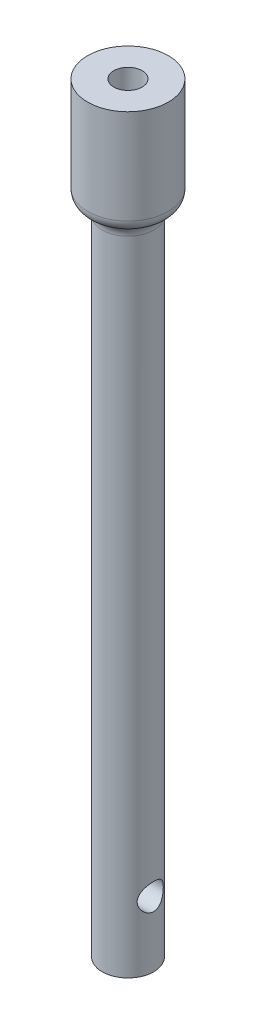
ISO-10303-21;
HEADER;
FILE_DESCRIPTION(('STEP AP214'),'2;1');
FILE_NAME('part.step','',(''),(''),'','','');
FILE_SCHEMA(('AUTOMOTIVE_DESIGN { 1 0 10303 214 1 1 1 1 }'));
ENDSEC;
DATA;
#1=APPLICATION_CONTEXT('core data for automotive mechanical design processes');
#2=APPLICATION_PROTOCOL_DEFINITION('international standard','automotive_design',2000,#1);
#3=PRODUCT_CONTEXT('',#1,'mechanical');
#4=PRODUCT('Part','Part','',(#3));
#5=PRODUCT_RELATED_PRODUCT_CATEGORY('part','',(#4));
#6=PRODUCT_DEFINITION_FORMATION('','',#4);
#7=PRODUCT_DEFINITION_CONTEXT('part definition',#1,'design');
#8=PRODUCT_DEFINITION('design','',#6,#7);
#9=PRODUCT_DEFINITION_SHAPE('','',#8);
#10=(LENGTH_UNIT() NAMED_UNIT(*) SI_UNIT(.MILLI.,.METRE.));
#11=(NAMED_UNIT(*) PLANE_ANGLE_UNIT() SI_UNIT($,.RADIAN.));
#12=(NAMED_UNIT(*) SI_UNIT($,.STERADIAN.) SOLID_ANGLE_UNIT());
#13=UNCERTAINTY_MEASURE_WITH_UNIT(LENGTH_MEASURE(1.E-05),#10,'distance_accuracy_value','');
#14=(GEOMETRIC_REPRESENTATION_CONTEXT(3) GLOBAL_UNCERTAINTY_ASSIGNED_CONTEXT((#13)) GLOBAL_UNIT_ASSIGNED_CONTEXT((#10,
#11,#12)) REPRESENTATION_CONTEXT('',''));
#15=CARTESIAN_POINT('',(0.,0.,0.));
#16=DIRECTION('',(0.,0.,1.));
#17=DIRECTION('',(1.,0.,0.));
#18=AXIS2_PLACEMENT_3D('',#15,#16,#17);
#19=CARTESIAN_POINT('',(0.,220.,0.));
#20=DIRECTION('',(0.,1.,0.));
#21=DIRECTION('',(-1.,0.,0.));
#22=AXIS2_PLACEMENT_3D('',#19,#20,#21);
#23=CYLINDRICAL_SURFACE('',#22,4.35);
#24=CARTESIAN_POINT('',(0.,233.,0.));
#25=DIRECTION('',(0.,1.,0.));
#26=DIRECTION('',(-1.,0.,0.));
#27=AXIS2_PLACEMENT_3D('',#24,#25,#26);
#28=CIRCLE('',#27,4.35);
#29=CARTESIAN_POINT('',(-4.35,233.,0.));
#30=VERTEX_POINT('',#29);
#31=EDGE_CURVE('E76',#30,#30,#28,.T.);
#32=ORIENTED_EDGE('',*,*,#31,.T.);
#33=EDGE_LOOP('',(#32));
#34=FACE_BOUND('',#33,.T.);
#35=CARTESIAN_POINT('',(0.,220.,0.));
#36=DIRECTION('',(0.,1.,0.));
#37=DIRECTION('',(-1.,0.,0.));
#38=AXIS2_PLACEMENT_3D('',#35,#36,#37);
#39=CIRCLE('',#38,4.35);
#40=CARTESIAN_POINT('',(2.35,220.,-3.66060104354463));
#41=VERTEX_POINT('',#40);
#42=CARTESIAN_POINT('',(2.35,220.,3.66060104354463));
#43=VERTEX_POINT('',#42);
#44=EDGE_CURVE('E73',#41,#43,#39,.T.);
#45=ORIENTED_EDGE('',*,*,#44,.F.);
#46=DIRECTION('',(0.,-1.,0.));
#47=VECTOR('',#46,1.);
#48=CARTESIAN_POINT('',(2.35,230.,-3.66060104354463));
#49=LINE('',#48,#47);
#50=CARTESIAN_POINT('',(2.35,230.,-3.66060104354463));
#51=VERTEX_POINT('',#50);
#52=EDGE_CURVE('E50',#51,#41,#49,.T.);
#53=ORIENTED_EDGE('',*,*,#52,.F.);
#54=CARTESIAN_POINT('',(0.,230.,0.));
#55=DIRECTION('',(0.,1.,0.));
#56=DIRECTION('',(0.,0.,1.));
#57=AXIS2_PLACEMENT_3D('',#54,#55,#56);
#58=CIRCLE('',#57,4.35);
#59=CARTESIAN_POINT('',(2.35,230.,3.66060104354463));
#60=VERTEX_POINT('',#59);
#61=EDGE_CURVE('E69',#60,#51,#58,.T.);
#62=ORIENTED_EDGE('',*,*,#61,.F.);
#63=DIRECTION('',(0.,-1.,0.));
#64=VECTOR('',#63,1.);
#65=CARTESIAN_POINT('',(2.35,230.,3.66060104354463));
#66=LINE('',#65,#64);
#67=EDGE_CURVE('E64',#60,#43,#66,.T.);
#68=ORIENTED_EDGE('',*,*,#67,.T.);
#69=EDGE_LOOP('',(#45,#53,#62,#68));
#70=FACE_BOUND('',#69,.T.);
#71=ADVANCED_FACE('F35',(#34,#70),#23,.F.);
#72=CARTESIAN_POINT('',(-4.35,220.,0.));
#73=DIRECTION('',(0.,1.,0.));
#74=DIRECTION('',(-1.,0.,0.));
#75=AXIS2_PLACEMENT_3D('',#72,#73,#74);
#76=PLANE('',#75);
#77=ORIENTED_EDGE('',*,*,#44,.T.);
#78=DIRECTION('',(0.,0.,1.));
#79=VECTOR('',#78,1.);
#80=CARTESIAN_POINT('',(2.35,220.,0.));
#81=LINE('',#80,#79);
#82=EDGE_CURVE('E61',#41,#43,#81,.T.);
#83=ORIENTED_EDGE('',*,*,#82,.F.);
#84=EDGE_LOOP('',(#77,#83));
#85=FACE_BOUND('',#84,.T.);
#86=ADVANCED_FACE('F75',(#85),#76,.T.);
#87=CARTESIAN_POINT('',(0.,0.,0.));
#88=DIRECTION('',(0.,-1.,0.));
#89=DIRECTION('',(1.,0.,0.));
#90=AXIS2_PLACEMENT_3D('',#87,#88,#89);
#91=PLANE('',#90);
#92=CARTESIAN_POINT('',(0.,0.,0.));
#93=DIRECTION('',(0.,1.,0.));
#94=DIRECTION('',(-1.,0.,0.));
#95=AXIS2_PLACEMENT_3D('',#92,#93,#94);
#96=CIRCLE('',#95,7.9);
#97=CARTESIAN_POINT('',(-7.9,0.,0.));
#98=VERTEX_POINT('',#97);
#99=EDGE_CURVE('E85',#98,#98,#96,.T.);
#100=ORIENTED_EDGE('',*,*,#99,.F.);
#101=EDGE_LOOP('',(#100));
#102=FACE_BOUND('',#101,.T.);
#103=ADVANCED_FACE('F120',(#102),#91,.T.);
#104=CARTESIAN_POINT('',(0.,220.,0.));
#105=DIRECTION('',(0.,1.,0.));
#106=DIRECTION('',(-1.,0.,0.));
#107=AXIS2_PLACEMENT_3D('',#104,#105,#106);
#108=CYLINDRICAL_SURFACE('',#107,7.9);
#109=CARTESIAN_POINT('',(0.,196.830795023156,0.));
#110=DIRECTION('',(0.,1.,0.));
#111=DIRECTION('',(-1.,0.,0.));
#112=AXIS2_PLACEMENT_3D('',#109,#110,#111);
#113=CIRCLE('',#112,7.9);
#114=CARTESIAN_POINT('',(-7.9,196.830795023156,0.));
#115=VERTEX_POINT('',#114);
#116=EDGE_CURVE('E11',#115,#115,#113,.F.);
#117=ORIENTED_EDGE('',*,*,#116,.T.);
#118=EDGE_LOOP('',(#117));
#119=FACE_BOUND('',#118,.T.);
#120=CARTESIAN_POINT('',(-7.9,16.,0.));
#121=CARTESIAN_POINT('',(-7.89999974326194,16.0000002892942,0.105030355423712));
#122=CARTESIAN_POINT('',(-7.89790047747461,16.0041416620161,0.210065854151533));
#123=CARTESIAN_POINT('',(-7.88955731330269,16.0206578079268,0.419359685412036));
#124=CARTESIAN_POINT('',(-7.88331168129006,16.0330360250093,0.52361767441581));
#125=CARTESIAN_POINT('',(-7.86682303781086,16.0659043212627,0.730677490115829));
#126=CARTESIAN_POINT('',(-7.85657455298263,16.0864055080562,0.833477122391393));
#127=CARTESIAN_POINT('',(-7.83234629696176,16.1352760728215,1.03675350148522));
#128=CARTESIAN_POINT('',(-7.81836500057555,16.1636486671662,1.13722928052203));
#129=CARTESIAN_POINT('',(-7.7714459431176,16.2598721560975,1.43327688410579));
#130=CARTESIAN_POINT('',(-7.73344417287942,16.3389989282909,1.62451959753274));
#131=CARTESIAN_POINT('',(-7.64741391394349,16.5244195730602,1.99061587701824));
#132=CARTESIAN_POINT('',(-7.59938605156838,16.6307117487264,2.16547046584277));
#133=CARTESIAN_POINT('',(-7.49421305018786,16.8749232668228,2.50607913541061));
#134=CARTESIAN_POINT('',(-7.43668860357155,17.0143870936976,2.6706098179426));
#135=CARTESIAN_POINT('',(-7.32022262086627,17.3175948281385,2.97505854091777));
#136=CARTESIAN_POINT('',(-7.26128001591896,17.4813575626054,3.11495731100717));
#137=CARTESIAN_POINT('',(-7.14317193551608,17.8444163400706,3.37749122414735));
#138=CARTESIAN_POINT('',(-7.08436624958561,18.0455073575278,3.49784826094683));
#139=CARTESIAN_POINT('',(-7.00580901734669,18.3623585147373,3.65129455073703));
#140=CARTESIAN_POINT('',(-6.98122520578246,18.4705501357025,3.69793951914284));
#141=CARTESIAN_POINT('',(-6.93620031234022,18.6913636996881,3.78171735483549));
#142=CARTESIAN_POINT('',(-6.91575675143148,18.8039829430795,3.81885591774758));
#143=CARTESIAN_POINT('',(-6.88095029874377,19.0259546427392,3.88120116806592));
#144=CARTESIAN_POINT('',(-6.86629640794754,19.1350983663657,3.90698956573442));
#145=CARTESIAN_POINT('',(-6.8420152512109,19.3556605838196,3.94935764289151));
#146=CARTESIAN_POINT('',(-6.83238528539859,19.4670778223303,3.96594226881995));
#147=CARTESIAN_POINT('',(-6.81856813282619,19.691180392024,3.98965140930813));
#148=CARTESIAN_POINT('',(-6.81437746738349,19.8038648661866,3.99678197023975));
#149=CARTESIAN_POINT('',(-6.81161860089242,20.0294952726462,4.00148228877337));
#150=CARTESIAN_POINT('',(-6.81304983862458,20.1424411777203,3.99905300070932));
#151=CARTESIAN_POINT('',(-6.82094579868876,20.3535727352705,3.98556752403533));
#152=CARTESIAN_POINT('',(-6.82676556441021,20.4518549536128,3.97561636469917));
#153=CARTESIAN_POINT('',(-6.84245971450048,20.6471080740119,3.94854165195411));
#154=CARTESIAN_POINT('',(-6.85233536767017,20.7440785559047,3.93141585407363));
#155=CARTESIAN_POINT('',(-6.88759171848113,21.0320161533534,3.86954771341741));
#156=CARTESIAN_POINT('',(-6.91860783899296,21.2201516609621,3.81430520236363));
#157=CARTESIAN_POINT('',(-6.99284416527983,21.5884995507509,3.67645598092139));
#158=CARTESIAN_POINT('',(-7.03633109292407,21.7684264191954,3.59324350696203));
#159=CARTESIAN_POINT('',(-7.13063376216339,22.1126679136086,3.40226267800552));
#160=CARTESIAN_POINT('',(-7.18145279487094,22.2769754734083,3.29448328315597));
#161=CARTESIAN_POINT('',(-7.29269429420413,22.6078282907292,3.04107908445073));
#162=CARTESIAN_POINT('',(-7.3535046648423,22.7718686654976,2.89235127479011));
#163=CARTESIAN_POINT('',(-7.47254836479071,23.073800536734,2.56916422163046));
#164=CARTESIAN_POINT('',(-7.53078039067481,23.2116789207165,2.39469215247803));
#165=CARTESIAN_POINT('',(-7.6131586058754,23.399046005838,2.1119067443416));
#166=CARTESIAN_POINT('',(-7.64035721928503,23.4594115025598,2.0115320845985));
#167=CARTESIAN_POINT('',(-7.69169937773719,23.5713750458255,1.8052781707983));
#168=CARTESIAN_POINT('',(-7.71584421237342,23.6229767964276,1.69940126713828));
#169=CARTESIAN_POINT('',(-7.76036591092704,23.7168515235388,1.48288097038576));
#170=CARTESIAN_POINT('',(-7.78074434066851,23.7591283781482,1.37223958174828));
#171=CARTESIAN_POINT('',(-7.8171236462859,23.8338608710172,1.14698932082252));
#172=CARTESIAN_POINT('',(-7.83312504023045,23.8663176716328,1.03238091988277));
#173=CARTESIAN_POINT('',(-7.85909847239651,23.9186603667973,0.809959262578977));
#174=CARTESIAN_POINT('',(-7.86946476008195,23.9393746711275,0.7023864692307));
#175=CARTESIAN_POINT('',(-7.88581165461011,23.9719295767871,0.485580322168009));
#176=CARTESIAN_POINT('',(-7.89179266253058,23.9837709896335,0.376347121247486));
#177=CARTESIAN_POINT('',(-7.89919730166462,23.9984194395117,0.157165723276311));
#178=CARTESIAN_POINT('',(-7.90062274017059,24.0012300592558,0.0472178271115035));
#179=CARTESIAN_POINT('',(-7.89888059257281,23.9977889781874,-0.172495273618029));
#180=CARTESIAN_POINT('',(-7.89571321999931,23.9915376986832,-0.282260486438589));
#181=CARTESIAN_POINT('',(-7.88531113396588,23.9709198495986,-0.491915004917143));
#182=CARTESIAN_POINT('',(-7.87842317131166,23.9572446882902,-0.591890044204379));
#183=CARTESIAN_POINT('',(-7.86100979646681,23.9224602644512,-0.790227848208988));
#184=CARTESIAN_POINT('',(-7.85048315195254,23.9013484832914,-0.888590054866886));
#185=CARTESIAN_POINT('',(-7.81379211212464,23.8271724739966,-1.18020675248324));
#186=CARTESIAN_POINT('',(-7.7825065741195,23.7632485489558,-1.37018038710244));
#187=CARTESIAN_POINT('',(-7.70801264820104,23.6067031585947,-1.74170773123375));
#188=CARTESIAN_POINT('',(-7.66449468691239,23.5133276328474,-1.92287625345581));
#189=CARTESIAN_POINT('',(-7.56967686499314,23.3013611247766,-2.26759115995563));
#190=CARTESIAN_POINT('',(-7.51837373214007,23.1827595311056,-2.43113008458299));
#191=CARTESIAN_POINT('',(-7.40685344008681,22.9100683806844,-2.75325607693541));
#192=CARTESIAN_POINT('',(-7.34625802207357,22.7536150644413,-2.90970943250473));
#193=CARTESIAN_POINT('',(-7.22666931672465,22.4165117355947,-3.19518932302647));
#194=CARTESIAN_POINT('',(-7.16767723534095,22.2358440845806,-3.32419568587548));
#195=CARTESIAN_POINT('',(-7.08391192667782,21.9444994979911,-3.49751557638399));
#196=CARTESIAN_POINT('',(-7.05616078885691,21.8411813241736,-3.55301013846864));
#197=CARTESIAN_POINT('',(-7.00389124036985,21.6294184907216,-3.65496717427654));
#198=CARTESIAN_POINT('',(-6.97937127148744,21.5209763366349,-3.70143400674679));
#199=CARTESIAN_POINT('',(-6.9345217883005,21.299736355335,-3.7847920060282));
#200=CARTESIAN_POINT('',(-6.91418881945415,21.1869422107752,-3.82169107342396));
#201=CARTESIAN_POINT('',(-6.87855652118034,20.9577778249567,-3.88545988985966));
#202=CARTESIAN_POINT('',(-6.86325638862617,20.8414081575144,-3.91233123918846));
#203=CARTESIAN_POINT('',(-6.83960223930732,20.6175167241593,-3.95352354365859));
#204=CARTESIAN_POINT('',(-6.83071966696499,20.5102273070628,-3.96880673291813));
#205=CARTESIAN_POINT('',(-6.81799965842684,20.2944709027418,-3.99061917549394));
#206=CARTESIAN_POINT('',(-6.81416166405487,20.1860040471387,-3.99714939731652));
#207=CARTESIAN_POINT('',(-6.81169564539614,19.9688746994429,-4.00135124842025));
#208=CARTESIAN_POINT('',(-6.8130656347936,19.8602122977331,-3.99902625506413));
#209=CARTESIAN_POINT('',(-6.8209414363359,19.6436538427938,-3.98557462361757));
#210=CARTESIAN_POINT('',(-6.82744701748266,19.5357577553158,-3.97444838140584));
#211=CARTESIAN_POINT('',(-6.8525146183381,19.2360507486965,-3.93117794537888));
#212=CARTESIAN_POINT('',(-6.87655512752699,19.0459966809426,-3.88934621047486));
#213=CARTESIAN_POINT('',(-6.93754911414543,18.6759611512395,-3.7794557789441));
#214=CARTESIAN_POINT('',(-6.97450683376607,18.4959830209239,-3.71138846543371));
#215=CARTESIAN_POINT('',(-7.06016669913318,18.137685223288,-3.54588185344455));
#216=CARTESIAN_POINT('',(-7.10948969827281,17.9602841396984,-3.44678054377874));
#217=CARTESIAN_POINT('',(-7.21333285722919,17.6234679028573,-3.2238081876595));
#218=CARTESIAN_POINT('',(-7.26785574687759,17.4640622938014,-3.09992409289966));
#219=CARTESIAN_POINT('',(-7.38415278594377,17.14690604811,-2.81268790384531));
#220=CARTESIAN_POINT('',(-7.4459765602823,16.9918845196303,-2.64633163492458));
#221=CARTESIAN_POINT('',(-7.56370384687748,16.7112507084625,-2.28818900499534));
#222=CARTESIAN_POINT('',(-7.6196040574889,16.5856547801295,-2.09638859477865));
#223=CARTESIAN_POINT('',(-7.69478318761917,16.4220065073086,-1.79205596315752));
#224=CARTESIAN_POINT('',(-7.718504407642,16.3713712188137,-1.68721263305615));
#225=CARTESIAN_POINT('',(-7.76225333479594,16.2792165413334,-1.4728727692572));
#226=CARTESIAN_POINT('',(-7.78228285768672,16.2376926689769,-1.3633785558788));
#227=CARTESIAN_POINT('',(-7.81801213665396,16.1643336589293,-1.14077721382273));
#228=CARTESIAN_POINT('',(-7.83372120349474,16.1324776709538,-1.02767844991059));
#229=CARTESIAN_POINT('',(-7.86037273798311,16.0787750202246,-0.798633509505721));
#230=CARTESIAN_POINT('',(-7.87131806827031,16.0569223458382,-0.682689087413789));
#231=CARTESIAN_POINT('',(-7.88642604135818,16.0268595125808,-0.472318675223722));
#232=CARTESIAN_POINT('',(-7.89150659022852,16.0167966253811,-0.378218342982565));
#233=CARTESIAN_POINT('',(-7.89829373120969,16.0033666475549,-0.189413412105658));
#234=CARTESIAN_POINT('',(-7.90000023150786,15.9999997391354,-0.0947087970968657));
#235=CARTESIAN_POINT('',(-7.9,16.,0.));
#236=B_SPLINE_CURVE_WITH_KNOTS('',3,(#120,#121,#122,#123,#124,#125,#126,#127,#128,#129,#130,
#131,#132,#133,#134,#135,#136,#137,#138,#139,#140,#141,#142,#143,#144,#145,#146,#147,#148,#149,
#150,#151,#152,#153,#154,#155,#156,#157,#158,#159,#160,#161,#162,#163,#164,#165,#166,#167,#168,
#169,#170,#171,#172,#173,#174,#175,#176,#177,#178,#179,#180,#181,#182,#183,#184,#185,#186,#187,
#188,#189,#190,#191,#192,#193,#194,#195,#196,#197,#198,#199,#200,#201,#202,#203,#204,#205,#206,
#207,#208,#209,#210,#211,#212,#213,#214,#215,#216,#217,#218,#219,#220,#221,#222,#223,#224,#225,
#226,#227,#228,#229,#230,#231,#232,#233,#234,#235),.UNSPECIFIED.,.T.,.F.,(4,2,2,2,2,2,2,2,2,2,2,
2,2,2,2,2,2,2,2,2,2,2,2,2,2,2,2,2,2,2,2,2,2,2,2,2,2,2,2,2,2,2,2,2,2,2,2,2,2,2,2,2,2,2,2,2,2,4),
(0.,0.314997426512901,0.63012663892187,0.945688265119548,1.261379024834,1.88959720738978,
2.51777615735311,3.18463679773118,3.85201684911854,4.57281530968725,4.93345625460133,
5.29388061827752,5.63270378580962,5.97134468073119,6.30976889234729,6.64815932084365,
6.94466483760132,7.24126318074209,7.83403716521488,8.4405789920717,9.04739392519375,
9.73337884885139,10.4197066877037,10.7800369665323,11.1402145681964,11.5002420931619,
11.8602269865927,12.1898987948637,12.519540447584,12.8490513081237,13.1785468494433,
13.4816040733025,13.7847640352138,14.3905200858336,15.0132528779273,15.6362481425192,
16.3215948131452,17.007443450925,17.3685884075982,17.7295585614174,18.0902296879089,
18.4508432315027,18.7765912302282,19.1023031823159,19.4278909209081,19.7534640154504,
20.3388895206226,20.9245074685875,21.5493514775672,22.1745253411866,22.8783193783996,
23.5825036518905,23.9385580487542,24.2944368503367,24.6495425991363,25.0044346610445,
25.2884688858898,25.5725108396021),.UNSPECIFIED.);
#237=CARTESIAN_POINT('',(-7.9,16.,0.));
#238=VERTEX_POINT('',#237);
#239=EDGE_CURVE('E70',#238,#238,#236,.T.);
#240=ORIENTED_EDGE('',*,*,#239,.F.);
#241=EDGE_LOOP('',(#240));
#242=FACE_BOUND('',#241,.T.);
#243=CARTESIAN_POINT('',(6.81248853210044,20.,-4.));
#244=CARTESIAN_POINT('',(6.81248902646816,20.1040582320195,-3.9999996189172));
#245=CARTESIAN_POINT('',(6.81488096341231,20.2081232486825,-3.9959338997901));
#246=CARTESIAN_POINT('',(6.8243579598398,20.4154458375316,-3.9797266747341));
#247=CARTESIAN_POINT('',(6.8314451281446,20.5187030257938,-3.96758153999728));
#248=CARTESIAN_POINT('',(6.85006189596483,20.7237278425917,-3.93535244365669));
#249=CARTESIAN_POINT('',(6.86159824551742,20.8254929627535,-3.91525641822285));
#250=CARTESIAN_POINT('',(6.88869279080161,21.0266689092288,-3.86738429139156));
#251=CARTESIAN_POINT('',(6.90425273960109,21.126078688668,-3.83960484198546));
#252=CARTESIAN_POINT('',(6.95600228523275,21.4186444941276,-3.74555362754238));
#253=CARTESIAN_POINT('',(6.99739559759641,21.60748891111,-3.66835138352928));
#254=CARTESIAN_POINT('',(7.08926838531521,21.9693955140954,-3.48747825556127));
#255=CARTESIAN_POINT('',(7.13974854817665,22.1424565044389,-3.383805368603));
#256=CARTESIAN_POINT('',(7.24933048299221,22.484180249276,-3.14264236486507));
#257=CARTESIAN_POINT('',(7.30880035601045,22.651228915408,-3.00303168605627));
#258=CARTESIAN_POINT('',(7.42671783069597,22.9608559246805,-2.69824042748942));
#259=CARTESIAN_POINT('',(7.48516489765344,23.1034217926741,-2.53304689310105));
#260=CARTESIAN_POINT('',(7.56976320752312,23.3007811093124,-2.26241165996242));
#261=CARTESIAN_POINT('',(7.59830355793918,23.3655812481772,-2.16486488092228));
#262=CARTESIAN_POINT('',(7.65269976214945,23.4866521296743,-1.96392401518271));
#263=CARTESIAN_POINT('',(7.67855675805761,23.5429265058494,-1.86053244538262));
#264=CARTESIAN_POINT('',(7.72684530591376,23.6463998012438,-1.64853969054746));
#265=CARTESIAN_POINT('',(7.74927694199644,23.693598943379,-1.5399386335555));
#266=CARTESIAN_POINT('',(7.79003365015234,23.7783602158714,-1.31835217262571));
#267=CARTESIAN_POINT('',(7.80836105492395,23.8159278222172,-1.20536930221604));
#268=CARTESIAN_POINT('',(7.83919295955791,23.8786125147305,-0.984179260865125));
#269=CARTESIAN_POINT('',(7.85202239212255,23.9044328201599,-0.876216452430929));
#270=CARTESIAN_POINT('',(7.87329886555581,23.9470465726817,-0.658147047220164));
#271=CARTESIAN_POINT('',(7.88174806723278,23.9638444707588,-0.548041535326256));
#272=CARTESIAN_POINT('',(7.8940251578848,23.9882006022838,-0.326589334968544));
#273=CARTESIAN_POINT('',(7.89785443274037,23.9957616066133,-0.21524302883719));
#274=CARTESIAN_POINT('',(7.90078305242078,24.0015470899127,0.00774938436626871));
#275=CARTESIAN_POINT('',(7.8998826963926,23.9997721593761,0.119395472030901));
#276=CARTESIAN_POINT('',(7.89366963857231,23.9874861682052,0.33205138138806));
#277=CARTESIAN_POINT('',(7.88875871854439,23.9777705451651,0.433119520499351));
#278=CARTESIAN_POINT('',(7.87516477582307,23.9507402816632,0.633986884570087));
#279=CARTESIAN_POINT('',(7.8664805411923,23.9334231996979,0.733785691228233));
#280=CARTESIAN_POINT('',(7.83505315926083,23.8703293728609,1.03016863358259));
#281=CARTESIAN_POINT('',(7.8069289032573,23.8133980538829,1.2239397103724));
#282=CARTESIAN_POINT('',(7.738420661224,23.6711121487685,1.60132430615742));
#283=CARTESIAN_POINT('',(7.69787576347624,23.585382982823,1.78476467227453));
#284=CARTESIAN_POINT('',(7.60815308718378,23.3884623822482,2.13511808586152));
#285=CARTESIAN_POINT('',(7.55897224745387,23.2772619145283,2.3020252398746));
#286=CARTESIAN_POINT('',(7.45097964713873,23.0202589598682,2.63169534664326));
#287=CARTESIAN_POINT('',(7.3916965192519,22.8721557451262,2.79251193995947));
#288=CARTESIAN_POINT('',(7.27318115979115,22.5517392906147,3.08808010352211));
#289=CARTESIAN_POINT('',(7.21394900678925,22.3794067917972,3.22281073440357));
#290=CARTESIAN_POINT('',(7.09793382135532,22.0012438795168,3.47122333364976));
#291=CARTESIAN_POINT('',(7.04157402789108,21.7939495624738,3.58291566815051));
#292=CARTESIAN_POINT('',(6.96822437239466,21.4687935699707,3.72244642123258));
#293=CARTESIAN_POINT('',(6.94563613576117,21.3580158559523,3.76429421435306));
#294=CARTESIAN_POINT('',(6.9050813245917,21.1324407685987,3.83818076660687));
#295=CARTESIAN_POINT('',(6.88711186631407,21.017645954468,3.87022564859192));
#296=CARTESIAN_POINT('',(6.85780469654587,20.7942077591648,3.9219033703193));
#297=CARTESIAN_POINT('',(6.8460539452623,20.6857989115799,3.94231924831373));
#298=CARTESIAN_POINT('',(6.82762913414081,20.4672877969551,3.974144043529));
#299=CARTESIAN_POINT('',(6.82095240069926,20.3571864529733,3.98555770432213));
#300=CARTESIAN_POINT('',(6.81295736757471,20.1362662514804,3.99920931982962));
#301=CARTESIAN_POINT('',(6.81163689328836,20.0254477034556,4.00145099830717));
#302=CARTESIAN_POINT('',(6.81440657321613,19.8040807649259,3.99673251152988));
#303=CARTESIAN_POINT('',(6.81849633943557,19.6935323556176,3.98977300613675));
#304=CARTESIAN_POINT('',(6.83114136645603,19.4862452278263,3.9680780633507));
#305=CARTESIAN_POINT('',(6.83913467000069,19.3893683436553,3.95431907744295));
#306=CARTESIAN_POINT('',(6.85895465128836,19.1972488124192,3.91983795330811));
#307=CARTESIAN_POINT('',(6.87078259018989,19.1020067138782,3.89911352416074));
#308=CARTESIAN_POINT('',(6.91148579289918,18.8196608687897,3.82680996036474));
#309=CARTESIAN_POINT('',(6.94558946282836,18.635802809171,3.76508609253894));
#310=CARTESIAN_POINT('',(7.02571865982176,18.2726720830465,3.61343400397586));
#311=CARTESIAN_POINT('',(7.07222159480928,18.0940022465305,3.52233600062204));
#312=CARTESIAN_POINT('',(7.17151204144717,17.753414471094,3.31550372326947));
#313=CARTESIAN_POINT('',(7.22430278271225,17.5915052214295,3.19975676453633));
#314=CARTESIAN_POINT('',(7.33845323904195,17.2670733136083,2.92939123732868));
#315=CARTESIAN_POINT('',(7.40003515771471,17.1072039548774,2.77167616621952));
#316=CARTESIAN_POINT('',(7.5189528822554,16.8152797663055,2.43061139044498));
#317=CARTESIAN_POINT('',(7.57628713098819,16.683235104206,2.24725235550404));
#318=CARTESIAN_POINT('',(7.65543476521835,16.5073644749327,1.95322723355277));
#319=CARTESIAN_POINT('',(7.68099216426898,16.4518070052254,1.85042081082036));
#320=CARTESIAN_POINT('',(7.72871196712387,16.3496527670326,1.63971079223584));
#321=CARTESIAN_POINT('',(7.75087587692523,16.3030520212832,1.53180948542283));
#322=CARTESIAN_POINT('',(7.79114417430446,16.2193556356184,1.31171170453467));
#323=CARTESIAN_POINT('',(7.80925056022776,16.1822553154179,1.19951737680543));
#324=CARTESIAN_POINT('',(7.84085796575672,16.1180111259117,0.97168116940884));
#325=CARTESIAN_POINT('',(7.85435954853166,16.0908660390465,0.856039713209138));
#326=CARTESIAN_POINT('',(7.87529906937762,16.0489708708955,0.633241464918693));
#327=CARTESIAN_POINT('',(7.88318499292971,16.0333010912981,0.526298877438961));
#328=CARTESIAN_POINT('',(7.89459941443705,16.0106646701414,0.311268549872134));
#329=CARTESIAN_POINT('',(7.89812826353266,16.0036973272446,0.203180902774564));
#330=CARTESIAN_POINT('',(7.90072980187795,15.9985582300512,-0.0132234598316225));
#331=CARTESIAN_POINT('',(7.899803849258,16.0003837950709,-0.121540095463901));
#332=CARTESIAN_POINT('',(7.89352538673335,16.0127990443557,-0.337536851830405));
#333=CARTESIAN_POINT('',(7.88817300912313,16.0233884666916,-0.445216991490993));
#334=CARTESIAN_POINT('',(7.87370633538014,16.0521657326893,-0.651694353316927));
#335=CARTESIAN_POINT('',(7.86487695717338,16.0697791450714,-0.750592013655539));
#336=CARTESIAN_POINT('',(7.84372199115249,16.1122875657036,-0.946440424267639));
#337=CARTESIAN_POINT('',(7.8313952119334,16.1371850553969,-1.04339049901549));
#338=CARTESIAN_POINT('',(7.78957301684771,16.2224411652052,-1.33033026744213));
#339=CARTESIAN_POINT('',(7.75522260937919,16.2933885743842,-1.5165867045931));
#340=CARTESIAN_POINT('',(7.67488298007479,16.4645007691254,-1.88222322153536));
#341=CARTESIAN_POINT('',(7.62846545839754,16.565767702669,-2.06098577390584));
#342=CARTESIAN_POINT('',(7.52877524850189,16.7933027066196,-2.39973773002208));
#343=CARTESIAN_POINT('',(7.4754994329954,16.9195821966474,-2.55971850551016));
#344=CARTESIAN_POINT('',(7.36096319145523,17.208382895957,-2.87347938869325));
#345=CARTESIAN_POINT('',(7.29944176615037,17.3732838291902,-3.0249740928695));
#346=CARTESIAN_POINT('',(7.17972785659066,17.7270883481527,-3.29907896707724));
#347=CARTESIAN_POINT('',(7.12153848562832,17.9160138670767,-3.42166244701586));
#348=CARTESIAN_POINT('',(7.0410183499403,18.217915605288,-3.58299585084921));
#349=CARTESIAN_POINT('',(7.01491338981397,18.3236554064325,-3.63368995935942));
#350=CARTESIAN_POINT('',(6.96640934130601,18.5398839566864,-3.72583548002639));
#351=CARTESIAN_POINT('',(6.94400834434678,18.6503702228292,-3.76729165615664));
#352=CARTESIAN_POINT('',(6.90386350946846,18.8750480022183,-3.84036534919393));
#353=CARTESIAN_POINT('',(6.8861077639705,18.9892291816729,-3.87200806124601));
#354=CARTESIAN_POINT('',(6.85597425166703,19.2205702322162,-3.92511845315332));
#355=CARTESIAN_POINT('',(6.8435927598896,19.337727980392,-3.94659318152394));
#356=CARTESIAN_POINT('',(6.82702465954254,19.5457774839034,-3.97516440173757));
#357=CARTESIAN_POINT('',(6.82158818976413,19.6362737637228,-3.98446797362197));
#358=CARTESIAN_POINT('',(6.81431978854098,19.8178449374332,-3.99688614753876));
#359=CARTESIAN_POINT('',(6.81248809939007,19.9089198698054,-4.0000003335543));
#360=CARTESIAN_POINT('',(6.81248853210044,20.,-4.));
#361=B_SPLINE_CURVE_WITH_KNOTS('',3,(#243,#244,#245,#246,#247,#248,#249,#250,#251,#252,#253,
#254,#255,#256,#257,#258,#259,#260,#261,#262,#263,#264,#265,#266,#267,#268,#269,#270,#271,#272,
#273,#274,#275,#276,#277,#278,#279,#280,#281,#282,#283,#284,#285,#286,#287,#288,#289,#290,#291,
#292,#293,#294,#295,#296,#297,#298,#299,#300,#301,#302,#303,#304,#305,#306,#307,#308,#309,#310,
#311,#312,#313,#314,#315,#316,#317,#318,#319,#320,#321,#322,#323,#324,#325,#326,#327,#328,#329,
#330,#331,#332,#333,#334,#335,#336,#337,#338,#339,#340,#341,#342,#343,#344,#345,#346,#347,#348,
#349,#350,#351,#352,#353,#354,#355,#356,#357,#358,#359,#360),.UNSPECIFIED.,.T.,.F.,(4,2,2,2,2,2,
2,2,2,2,2,2,2,2,2,2,2,2,2,2,2,2,2,2,2,2,2,2,2,2,2,2,2,2,2,2,2,2,2,2,2,2,2,2,2,2,2,2,2,2,2,2,2,2,
2,2,2,2,4),(0.,0.312080072435745,0.624300407977527,0.93699630123046,1.24982866520091,
1.87141811405713,2.49305461182424,3.16734377008843,3.84197549771662,4.20318717002756,
4.56424446405692,4.92529288826356,5.2861355816691,5.62091897985053,5.95553706875949,
6.29005475432765,6.62455128206106,6.92913489099703,7.23381640044801,7.84258435561018,
8.45959879006256,9.07683238097006,9.75349583143073,10.4307002122383,11.1528358410287,
11.5140464454057,11.8750309765343,12.2073757790598,12.5395453406678,12.8715800302756,
13.2035909093498,13.4977685237908,13.7920429874942,14.3801892690605,14.9954683790018,
15.6110648895836,16.3066410918534,17.0024710335027,17.360921964684,17.7192133548845,
18.0773278955328,18.4353986229093,18.7600838528868,19.084742914495,19.4093030039352,
19.7338533934576,20.036019694804,20.3382890542677,20.9422958240246,21.5716752776211,
22.2013427429793,22.8950495356477,23.5893942554124,23.9493786590461,24.309176987977,
24.6680437716018,25.0266614207984,25.29980063087,25.5729581992522),.UNSPECIFIED.);
#362=CARTESIAN_POINT('',(6.81248853210044,20.,-4.));
#363=VERTEX_POINT('',#362);
#364=EDGE_CURVE('E89',#363,#363,#361,.T.);
#365=ORIENTED_EDGE('',*,*,#364,.F.);
#366=EDGE_LOOP('',(#365));
#367=FACE_BOUND('',#366,.T.);
#368=ORIENTED_EDGE('',*,*,#99,.T.);
#369=EDGE_LOOP('',(#368));
#370=FACE_BOUND('',#369,.T.);
#371=ADVANCED_FACE('F101',(#119,#242,#367,#370),#108,.T.);
#372=CARTESIAN_POINT('',(0.,220.,0.));
#373=DIRECTION('',(0.,1.,0.));
#374=DIRECTION('',(-1.,0.,0.));
#375=AXIS2_PLACEMENT_3D('',#372,#373,#374);
#376=CYLINDRICAL_SURFACE('',#375,12.35);
#377=CARTESIAN_POINT('',(0.,204.,0.));
#378=DIRECTION('',(0.,-1.,0.));
#379=DIRECTION('',(1.,0.,0.));
#380=AXIS2_PLACEMENT_3D('',#377,#378,#379);
#381=CIRCLE('',#380,12.35);
#382=CARTESIAN_POINT('',(12.35,204.,0.));
#383=VERTEX_POINT('',#382);
#384=EDGE_CURVE('E88',#383,#383,#381,.F.);
#385=ORIENTED_EDGE('',*,*,#384,.T.);
#386=EDGE_LOOP('',(#385));
#387=FACE_BOUND('',#386,.T.);
#388=CARTESIAN_POINT('',(0.,233.,0.));
#389=DIRECTION('',(0.,1.,0.));
#390=DIRECTION('',(-1.,0.,0.));
#391=AXIS2_PLACEMENT_3D('',#388,#389,#390);
#392=CIRCLE('',#391,12.35);
#393=CARTESIAN_POINT('',(-12.35,233.,0.));
#394=VERTEX_POINT('',#393);
#395=EDGE_CURVE('E79',#394,#394,#392,.T.);
#396=ORIENTED_EDGE('',*,*,#395,.F.);
#397=EDGE_LOOP('',(#396));
#398=FACE_BOUND('',#397,.T.);
#399=ADVANCED_FACE('F125',(#387,#398),#376,.T.);
#400=CARTESIAN_POINT('',(-12.35,233.,0.));
#401=DIRECTION('',(0.,1.,0.));
#402=DIRECTION('',(-1.,0.,0.));
#403=AXIS2_PLACEMENT_3D('',#400,#401,#402);
#404=PLANE('',#403);
#405=ORIENTED_EDGE('',*,*,#395,.T.);
#406=EDGE_LOOP('',(#405));
#407=FACE_BOUND('',#406,.T.);
#408=ORIENTED_EDGE('',*,*,#31,.F.);
#409=EDGE_LOOP('',(#408));
#410=FACE_BOUND('',#409,.T.);
#411=ADVANCED_FACE('F117',(#407,#410),#404,.T.);
#412=CARTESIAN_POINT('',(2.35,230.,0.));
#413=DIRECTION('',(1.,0.,0.));
#414=DIRECTION('',(0.,1.,0.));
#415=AXIS2_PLACEMENT_3D('',#412,#413,#414);
#416=PLANE('',#415);
#417=ORIENTED_EDGE('',*,*,#82,.T.);
#418=ORIENTED_EDGE('',*,*,#67,.F.);
#419=DIRECTION('',(0.,0.,1.));
#420=VECTOR('',#419,1.);
#421=CARTESIAN_POINT('',(2.35,230.,0.));
#422=LINE('',#421,#420);
#423=EDGE_CURVE('E57',#51,#60,#422,.T.);
#424=ORIENTED_EDGE('',*,*,#423,.F.);
#425=ORIENTED_EDGE('',*,*,#52,.T.);
#426=EDGE_LOOP('',(#417,#418,#424,#425));
#427=FACE_BOUND('',#426,.T.);
#428=ADVANCED_FACE('F63',(#427),#416,.F.);
#429=CARTESIAN_POINT('',(0.,230.,0.));
#430=DIRECTION('',(0.,1.,0.));
#431=DIRECTION('',(0.,0.,1.));
#432=AXIS2_PLACEMENT_3D('',#429,#430,#431);
#433=PLANE('',#432);
#434=ORIENTED_EDGE('',*,*,#61,.T.);
#435=ORIENTED_EDGE('',*,*,#423,.T.);
#436=EDGE_LOOP('',(#434,#435));
#437=FACE_BOUND('',#436,.T.);
#438=ADVANCED_FACE('F110',(#437),#433,.T.);
#439=CARTESIAN_POINT('',(-12.35,20.,0.));
#440=DIRECTION('',(1.,0.,0.));
#441=DIRECTION('',(0.,0.,-1.));
#442=AXIS2_PLACEMENT_3D('',#439,#440,#441);
#443=CYLINDRICAL_SURFACE('',#442,4.);
#444=ORIENTED_EDGE('',*,*,#239,.T.);
#445=EDGE_LOOP('',(#444));
#446=FACE_BOUND('',#445,.T.);
#447=ORIENTED_EDGE('',*,*,#364,.T.);
#448=EDGE_LOOP('',(#447));
#449=FACE_BOUND('',#448,.T.);
#450=ADVANCED_FACE('F105',(#446,#449),#443,.F.);
#451=CARTESIAN_POINT('',(0.,204.,0.));
#452=DIRECTION('',(0.,-1.,0.));
#453=DIRECTION('',(1.,0.,0.));
#454=AXIS2_PLACEMENT_3D('',#451,#452,#453);
#455=TOROIDAL_SURFACE('',#454,8.35000000000001,4.);
#456=CARTESIAN_POINT('',(0.,200.415397511578,0.));
#457=DIRECTION('',(0.,1.,0.));
#458=DIRECTION('',(-1.,0.,0.));
#459=AXIS2_PLACEMENT_3D('',#456,#457,#458);
#460=CIRCLE('',#459,10.125);
#461=CARTESIAN_POINT('',(-10.125,200.415397511578,0.));
#462=VERTEX_POINT('',#461);
#463=EDGE_CURVE('E43',#462,#462,#460,.T.);
#464=ORIENTED_EDGE('',*,*,#463,.T.);
#465=EDGE_LOOP('',(#464));
#466=FACE_BOUND('',#465,.T.);
#467=ORIENTED_EDGE('',*,*,#384,.F.);
#468=EDGE_LOOP('',(#467));
#469=FACE_BOUND('',#468,.T.);
#470=ADVANCED_FACE('F109',(#466,#469),#455,.T.);
#471=CARTESIAN_POINT('',(0.,196.830795023156,0.));
#472=DIRECTION('',(0.,1.,0.));
#473=DIRECTION('',(-1.,0.,0.));
#474=AXIS2_PLACEMENT_3D('',#471,#472,#473);
#475=TOROIDAL_SURFACE('',#474,11.9,4.);
#476=ORIENTED_EDGE('',*,*,#116,.F.);
#477=EDGE_LOOP('',(#476));
#478=FACE_BOUND('',#477,.T.);
#479=ORIENTED_EDGE('',*,*,#463,.F.);
#480=EDGE_LOOP('',(#479));
#481=FACE_BOUND('',#480,.T.);
#482=ADVANCED_FACE('F37',(#478,#481),#475,.F.);
#483=CLOSED_SHELL('',(#71,#86,#103,#371,#399,#411,#428,#438,#450,#470,#482));
#484=MANIFOLD_SOLID_BREP('B2',#483);
#485=ADVANCED_BREP_SHAPE_REPRESENTATION('',(#18,#484),#14);
#486=SHAPE_DEFINITION_REPRESENTATION(#9,#485);
ENDSEC;
END-ISO-10303-21;
